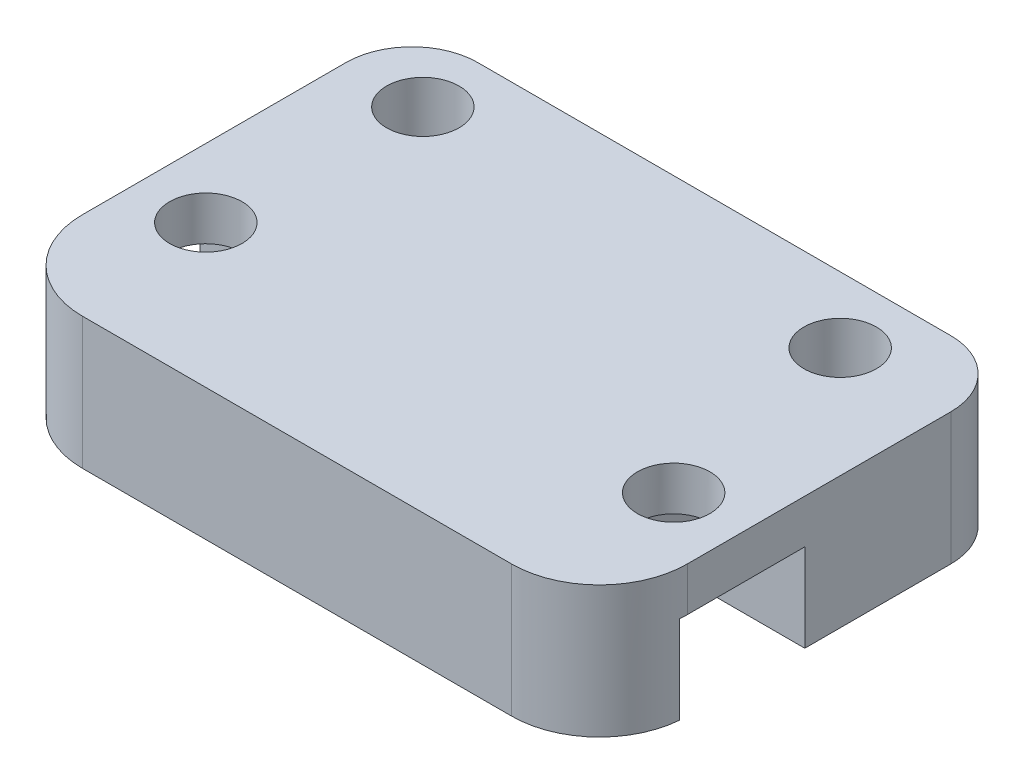
ISO-10303-21;
HEADER;
FILE_DESCRIPTION(('STEP AP214'),'2;1');
FILE_NAME('part.step','',(''),(''),'','','');
FILE_SCHEMA(('AUTOMOTIVE_DESIGN { 1 0 10303 214 1 1 1 1 }'));
ENDSEC;
DATA;
#1=APPLICATION_CONTEXT('core data for automotive mechanical design processes');
#2=APPLICATION_PROTOCOL_DEFINITION('international standard','automotive_design',2000,#1);
#3=PRODUCT_CONTEXT('',#1,'mechanical');
#4=PRODUCT('Part','Part','',(#3));
#5=PRODUCT_RELATED_PRODUCT_CATEGORY('part','',(#4));
#6=PRODUCT_DEFINITION_FORMATION('','',#4);
#7=PRODUCT_DEFINITION_CONTEXT('part definition',#1,'design');
#8=PRODUCT_DEFINITION('design','',#6,#7);
#9=PRODUCT_DEFINITION_SHAPE('','',#8);
#10=(LENGTH_UNIT() NAMED_UNIT(*) SI_UNIT(.MILLI.,.METRE.));
#11=(NAMED_UNIT(*) PLANE_ANGLE_UNIT() SI_UNIT($,.RADIAN.));
#12=(NAMED_UNIT(*) SI_UNIT($,.STERADIAN.) SOLID_ANGLE_UNIT());
#13=UNCERTAINTY_MEASURE_WITH_UNIT(LENGTH_MEASURE(1.E-05),#10,'distance_accuracy_value','');
#14=(GEOMETRIC_REPRESENTATION_CONTEXT(3) GLOBAL_UNCERTAINTY_ASSIGNED_CONTEXT((#13)) GLOBAL_UNIT_ASSIGNED_CONTEXT((#10,
#11,#12)) REPRESENTATION_CONTEXT('',''));
#15=CARTESIAN_POINT('',(0.,0.,0.));
#16=DIRECTION('',(0.,0.,1.));
#17=DIRECTION('',(1.,0.,0.));
#18=AXIS2_PLACEMENT_3D('',#15,#16,#17);
#19=CARTESIAN_POINT('',(10.65,-3.,6.5));
#20=DIRECTION('',(0.,1.,0.));
#21=DIRECTION('',(0.,0.,1.));
#22=AXIS2_PLACEMENT_3D('',#19,#20,#21);
#23=CYLINDRICAL_SURFACE('',#22,1.65);
#24=CARTESIAN_POINT('',(10.65,3.,6.5));
#25=DIRECTION('',(0.,1.,0.));
#26=DIRECTION('',(0.,0.,1.));
#27=AXIS2_PLACEMENT_3D('',#24,#25,#26);
#28=CIRCLE('',#27,1.65);
#29=CARTESIAN_POINT('',(10.65,3.,8.15));
#30=VERTEX_POINT('',#29);
#31=EDGE_CURVE('E256',#30,#30,#28,.T.);
#32=ORIENTED_EDGE('',*,*,#31,.T.);
#33=EDGE_LOOP('',(#32));
#34=FACE_BOUND('',#33,.T.);
#35=CARTESIAN_POINT('',(10.65,1.,6.5));
#36=DIRECTION('',(0.,-1.,0.));
#37=DIRECTION('',(0.,0.,-1.));
#38=AXIS2_PLACEMENT_3D('',#35,#36,#37);
#39=CIRCLE('',#38,1.65);
#40=CARTESIAN_POINT('',(10.65,1.,4.85));
#41=VERTEX_POINT('',#40);
#42=EDGE_CURVE('E235',#41,#41,#39,.F.);
#43=ORIENTED_EDGE('',*,*,#42,.F.);
#44=EDGE_LOOP('',(#43));
#45=FACE_BOUND('',#44,.T.);
#46=ADVANCED_FACE('F38',(#34,#45),#23,.F.);
#47=CARTESIAN_POINT('',(0.,-3.,13.));
#48=DIRECTION('',(0.,1.,0.));
#49=DIRECTION('',(0.,0.,1.));
#50=AXIS2_PLACEMENT_3D('',#47,#48,#49);
#51=PLANE('',#50);
#52=CARTESIAN_POINT('',(8.73,-3.,-3.00000000000006));
#53=DIRECTION('',(0.,1.,0.));
#54=DIRECTION('',(0.,0.,1.));
#55=AXIS2_PLACEMENT_3D('',#52,#53,#54);
#56=CIRCLE('',#55,1.65);
#57=CARTESIAN_POINT('',(8.73,-3.,-1.35000000000006));
#58=VERTEX_POINT('',#57);
#59=EDGE_CURVE('E247',#58,#58,#56,.T.);
#60=ORIENTED_EDGE('',*,*,#59,.T.);
#61=EDGE_LOOP('',(#60));
#62=FACE_BOUND('',#61,.T.);
#63=CARTESIAN_POINT('',(-10.27,-3.,-3.00000000000007));
#64=DIRECTION('',(0.,1.,0.));
#65=DIRECTION('',(0.,0.,1.));
#66=AXIS2_PLACEMENT_3D('',#63,#64,#65);
#67=CIRCLE('',#66,1.65);
#68=CARTESIAN_POINT('',(-10.27,-3.,-1.35000000000007));
#69=VERTEX_POINT('',#68);
#70=EDGE_CURVE('E242',#69,#69,#67,.T.);
#71=ORIENTED_EDGE('',*,*,#70,.T.);
#72=EDGE_LOOP('',(#71));
#73=FACE_BOUND('',#72,.T.);
#74=CARTESIAN_POINT('',(-9.77,-3.,9.));
#75=DIRECTION('',(0.,1.,0.));
#76=DIRECTION('',(0.,0.,1.));
#77=AXIS2_PLACEMENT_3D('',#74,#75,#76);
#78=CIRCLE('',#77,4.);
#79=CARTESIAN_POINT('',(-9.77,-3.,13.));
#80=VERTEX_POINT('',#79);
#81=CARTESIAN_POINT('',(-13.7546580781794,-3.,9.35));
#82=VERTEX_POINT('',#81);
#83=EDGE_CURVE('E290',#80,#82,#78,.F.);
#84=ORIENTED_EDGE('',*,*,#83,.T.);
#85=DIRECTION('',(-1.,0.,0.));
#86=VECTOR('',#85,1.);
#87=CARTESIAN_POINT('',(-12.2954482671904,-3.,9.35));
#88=LINE('',#87,#86);
#89=CARTESIAN_POINT('',(-9.00455173280957,-3.,9.35));
#90=VERTEX_POINT('',#89);
#91=EDGE_CURVE('E174',#90,#82,#88,.T.);
#92=ORIENTED_EDGE('',*,*,#91,.F.);
#93=DIRECTION('',(-0.5,0.,0.866025403784439));
#94=VECTOR('',#93,1.);
#95=CARTESIAN_POINT('',(-7.35910346561913,-3.,6.5));
#96=LINE('',#95,#94);
#97=CARTESIAN_POINT('',(-7.35910346561913,-3.,6.5));
#98=VERTEX_POINT('',#97);
#99=EDGE_CURVE('E197',#98,#90,#96,.T.);
#100=ORIENTED_EDGE('',*,*,#99,.F.);
#101=DIRECTION('',(0.5,0.,0.866025403784439));
#102=VECTOR('',#101,1.);
#103=CARTESIAN_POINT('',(-9.00455173280957,-3.,3.65));
#104=LINE('',#103,#102);
#105=CARTESIAN_POINT('',(-9.00455173280957,-3.,3.65));
#106=VERTEX_POINT('',#105);
#107=EDGE_CURVE('E194',#106,#98,#104,.T.);
#108=ORIENTED_EDGE('',*,*,#107,.F.);
#109=DIRECTION('',(1.,0.,0.));
#110=VECTOR('',#109,1.);
#111=CARTESIAN_POINT('',(-12.2954482671904,-3.,3.65));
#112=LINE('',#111,#110);
#113=CARTESIAN_POINT('',(-13.77,-3.,3.65));
#114=VERTEX_POINT('',#113);
#115=EDGE_CURVE('E180',#114,#106,#112,.T.);
#116=ORIENTED_EDGE('',*,*,#115,.F.);
#117=DIRECTION('',(0.,0.,-1.));
#118=VECTOR('',#117,1.);
#119=CARTESIAN_POINT('',(-13.77,-3.,13.));
#120=LINE('',#119,#118);
#121=CARTESIAN_POINT('',(-13.77,-3.,-2.99999999999999));
#122=VERTEX_POINT('',#121);
#123=EDGE_CURVE('E268',#114,#122,#120,.T.);
#124=ORIENTED_EDGE('',*,*,#123,.T.);
#125=CARTESIAN_POINT('',(-10.77,-3.,-3.));
#126=DIRECTION('',(0.,1.,0.));
#127=DIRECTION('',(0.,0.,1.));
#128=AXIS2_PLACEMENT_3D('',#125,#126,#127);
#129=CIRCLE('',#128,3.);
#130=CARTESIAN_POINT('',(-10.77,-3.,-6.));
#131=VERTEX_POINT('',#130);
#132=EDGE_CURVE('E303',#122,#131,#129,.F.);
#133=ORIENTED_EDGE('',*,*,#132,.T.);
#134=DIRECTION('',(-1.,0.,0.));
#135=VECTOR('',#134,1.);
#136=CARTESIAN_POINT('',(13.77,-3.,-6.));
#137=LINE('',#136,#135);
#138=CARTESIAN_POINT('',(10.77,-3.,-6.));
#139=VERTEX_POINT('',#138);
#140=EDGE_CURVE('E250',#139,#131,#137,.T.);
#141=ORIENTED_EDGE('',*,*,#140,.F.);
#142=CARTESIAN_POINT('',(10.77,-3.,-3.));
#143=DIRECTION('',(0.,1.,0.));
#144=DIRECTION('',(0.,0.,1.));
#145=AXIS2_PLACEMENT_3D('',#142,#143,#144);
#146=CIRCLE('',#145,3.);
#147=CARTESIAN_POINT('',(13.77,-3.,-2.99999999999999));
#148=VERTEX_POINT('',#147);
#149=EDGE_CURVE('E305',#139,#148,#146,.F.);
#150=ORIENTED_EDGE('',*,*,#149,.T.);
#151=DIRECTION('',(0.,0.,-1.));
#152=VECTOR('',#151,1.);
#153=CARTESIAN_POINT('',(13.77,-3.,13.));
#154=LINE('',#153,#152);
#155=CARTESIAN_POINT('',(13.77,-3.,3.65));
#156=VERTEX_POINT('',#155);
#157=EDGE_CURVE('E276',#156,#148,#154,.T.);
#158=ORIENTED_EDGE('',*,*,#157,.F.);
#159=DIRECTION('',(1.,0.,0.));
#160=VECTOR('',#159,1.);
#161=CARTESIAN_POINT('',(9.00455173280957,-3.,3.65));
#162=LINE('',#161,#160);
#163=CARTESIAN_POINT('',(9.00455173280957,-3.,3.65));
#164=VERTEX_POINT('',#163);
#165=EDGE_CURVE('E207',#164,#156,#162,.T.);
#166=ORIENTED_EDGE('',*,*,#165,.F.);
#167=DIRECTION('',(0.5,0.,-0.866025403784439));
#168=VECTOR('',#167,1.);
#169=CARTESIAN_POINT('',(7.35910346561913,-3.,6.5));
#170=LINE('',#169,#168);
#171=CARTESIAN_POINT('',(7.35910346561913,-3.,6.5));
#172=VERTEX_POINT('',#171);
#173=EDGE_CURVE('E221',#172,#164,#170,.T.);
#174=ORIENTED_EDGE('',*,*,#173,.F.);
#175=DIRECTION('',(-0.5,0.,-0.866025403784439));
#176=VECTOR('',#175,1.);
#177=CARTESIAN_POINT('',(9.00455173280957,-3.,9.35));
#178=LINE('',#177,#176);
#179=CARTESIAN_POINT('',(9.00455173280957,-3.,9.35));
#180=VERTEX_POINT('',#179);
#181=EDGE_CURVE('E218',#180,#172,#178,.T.);
#182=ORIENTED_EDGE('',*,*,#181,.F.);
#183=DIRECTION('',(-1.,0.,0.));
#184=VECTOR('',#183,1.);
#185=CARTESIAN_POINT('',(12.2954482671904,-3.,9.35));
#186=LINE('',#185,#184);
#187=CARTESIAN_POINT('',(13.7546580781794,-3.,9.35));
#188=VERTEX_POINT('',#187);
#189=EDGE_CURVE('E216',#188,#180,#186,.T.);
#190=ORIENTED_EDGE('',*,*,#189,.F.);
#191=CARTESIAN_POINT('',(9.77,-3.,9.));
#192=DIRECTION('',(0.,1.,0.));
#193=DIRECTION('',(0.,0.,1.));
#194=AXIS2_PLACEMENT_3D('',#191,#192,#193);
#195=CIRCLE('',#194,4.);
#196=CARTESIAN_POINT('',(9.77,-3.,13.));
#197=VERTEX_POINT('',#196);
#198=EDGE_CURVE('E293',#188,#197,#195,.F.);
#199=ORIENTED_EDGE('',*,*,#198,.T.);
#200=DIRECTION('',(1.,0.,0.));
#201=VECTOR('',#200,1.);
#202=CARTESIAN_POINT('',(0.,-3.,13.));
#203=LINE('',#202,#201);
#204=EDGE_CURVE('E260',#80,#197,#203,.T.);
#205=ORIENTED_EDGE('',*,*,#204,.F.);
#206=EDGE_LOOP('',(#84,#92,#100,#108,#116,#124,#133,#141,#150,#158,#166,#174,#182,#190,#199,#205));
#207=FACE_BOUND('',#206,.T.);
#208=ADVANCED_FACE('F327',(#62,#73,#207),#51,.F.);
#209=CARTESIAN_POINT('',(13.77,0.,13.));
#210=DIRECTION('',(-1.,0.,0.));
#211=DIRECTION('',(0.,0.,1.));
#212=AXIS2_PLACEMENT_3D('',#209,#210,#211);
#213=PLANE('',#212);
#214=DIRECTION('',(0.,0.,1.));
#215=VECTOR('',#214,1.);
#216=CARTESIAN_POINT('',(13.77,1.,13.));
#217=LINE('',#216,#215);
#218=CARTESIAN_POINT('',(13.77,1.,3.65));
#219=VERTEX_POINT('',#218);
#220=CARTESIAN_POINT('',(13.77,1.,9.));
#221=VERTEX_POINT('',#220);
#222=EDGE_CURVE('E53',#219,#221,#217,.T.);
#223=ORIENTED_EDGE('',*,*,#222,.F.);
#224=DIRECTION('',(0.,-1.,0.));
#225=VECTOR('',#224,1.);
#226=CARTESIAN_POINT('',(13.77,0.,3.65));
#227=LINE('',#226,#225);
#228=EDGE_CURVE('E11',#219,#156,#227,.T.);
#229=ORIENTED_EDGE('',*,*,#228,.T.);
#230=ORIENTED_EDGE('',*,*,#157,.T.);
#231=DIRECTION('',(0.,-1.,0.));
#232=VECTOR('',#231,1.);
#233=CARTESIAN_POINT('',(13.77,3.,-3.));
#234=LINE('',#233,#232);
#235=CARTESIAN_POINT('',(13.77,3.,-2.99999999999999));
#236=VERTEX_POINT('',#235);
#237=EDGE_CURVE('E308',#148,#236,#234,.F.);
#238=ORIENTED_EDGE('',*,*,#237,.T.);
#239=DIRECTION('',(0.,0.,-1.));
#240=VECTOR('',#239,1.);
#241=CARTESIAN_POINT('',(13.77,3.,13.));
#242=LINE('',#241,#240);
#243=CARTESIAN_POINT('',(13.77,3.,9.));
#244=VERTEX_POINT('',#243);
#245=EDGE_CURVE('E273',#244,#236,#242,.T.);
#246=ORIENTED_EDGE('',*,*,#245,.F.);
#247=DIRECTION('',(0.,1.,0.));
#248=VECTOR('',#247,1.);
#249=CARTESIAN_POINT('',(13.77,-3.,9.));
#250=LINE('',#249,#248);
#251=EDGE_CURVE('E287',#244,#221,#250,.F.);
#252=ORIENTED_EDGE('',*,*,#251,.T.);
#253=EDGE_LOOP('',(#223,#229,#230,#238,#246,#252));
#254=FACE_BOUND('',#253,.T.);
#255=ADVANCED_FACE('F348',(#254),#213,.F.);
#256=CARTESIAN_POINT('',(0.,3.,13.));
#257=DIRECTION('',(0.,1.,0.));
#258=DIRECTION('',(0.,0.,1.));
#259=AXIS2_PLACEMENT_3D('',#256,#257,#258);
#260=PLANE('',#259);
#261=CARTESIAN_POINT('',(8.73,3.,-3.00000000000006));
#262=DIRECTION('',(0.,-1.,0.));
#263=DIRECTION('',(0.,0.,-1.));
#264=AXIS2_PLACEMENT_3D('',#261,#262,#263);
#265=CIRCLE('',#264,1.65);
#266=CARTESIAN_POINT('',(8.73,3.,-4.65000000000006));
#267=VERTEX_POINT('',#266);
#268=EDGE_CURVE('E239',#267,#267,#265,.T.);
#269=ORIENTED_EDGE('',*,*,#268,.T.);
#270=EDGE_LOOP('',(#269));
#271=FACE_BOUND('',#270,.T.);
#272=CARTESIAN_POINT('',(-10.27,3.,-3.00000000000007));
#273=DIRECTION('',(0.,-1.,0.));
#274=DIRECTION('',(0.,0.,-1.));
#275=AXIS2_PLACEMENT_3D('',#272,#273,#274);
#276=CIRCLE('',#275,1.65);
#277=CARTESIAN_POINT('',(-10.27,3.,-4.65000000000007));
#278=VERTEX_POINT('',#277);
#279=EDGE_CURVE('E238',#278,#278,#276,.T.);
#280=ORIENTED_EDGE('',*,*,#279,.T.);
#281=EDGE_LOOP('',(#280));
#282=FACE_BOUND('',#281,.T.);
#283=CARTESIAN_POINT('',(-10.65,3.,6.5));
#284=DIRECTION('',(0.,1.,0.));
#285=DIRECTION('',(0.,0.,1.));
#286=AXIS2_PLACEMENT_3D('',#283,#284,#285);
#287=CIRCLE('',#286,1.65);
#288=CARTESIAN_POINT('',(-10.65,3.,8.15));
#289=VERTEX_POINT('',#288);
#290=EDGE_CURVE('E257',#289,#289,#287,.T.);
#291=ORIENTED_EDGE('',*,*,#290,.F.);
#292=EDGE_LOOP('',(#291));
#293=FACE_BOUND('',#292,.T.);
#294=ORIENTED_EDGE('',*,*,#31,.F.);
#295=EDGE_LOOP('',(#294));
#296=FACE_BOUND('',#295,.T.);
#297=ORIENTED_EDGE('',*,*,#245,.T.);
#298=CARTESIAN_POINT('',(10.77,3.,-3.));
#299=DIRECTION('',(0.,1.,0.));
#300=DIRECTION('',(0.,0.,1.));
#301=AXIS2_PLACEMENT_3D('',#298,#299,#300);
#302=CIRCLE('',#301,3.);
#303=CARTESIAN_POINT('',(10.77,3.,-6.));
#304=VERTEX_POINT('',#303);
#305=EDGE_CURVE('E312',#236,#304,#302,.T.);
#306=ORIENTED_EDGE('',*,*,#305,.T.);
#307=DIRECTION('',(1.,0.,0.));
#308=VECTOR('',#307,1.);
#309=CARTESIAN_POINT('',(-13.77,3.,-6.));
#310=LINE('',#309,#308);
#311=CARTESIAN_POINT('',(-10.77,3.,-6.));
#312=VERTEX_POINT('',#311);
#313=EDGE_CURVE('E253',#312,#304,#310,.T.);
#314=ORIENTED_EDGE('',*,*,#313,.F.);
#315=CARTESIAN_POINT('',(-10.77,3.,-3.));
#316=DIRECTION('',(0.,1.,0.));
#317=DIRECTION('',(0.,0.,1.));
#318=AXIS2_PLACEMENT_3D('',#315,#316,#317);
#319=CIRCLE('',#318,3.);
#320=CARTESIAN_POINT('',(-13.77,3.,-2.99999999999999));
#321=VERTEX_POINT('',#320);
#322=EDGE_CURVE('E310',#312,#321,#319,.T.);
#323=ORIENTED_EDGE('',*,*,#322,.T.);
#324=DIRECTION('',(0.,0.,-1.));
#325=VECTOR('',#324,1.);
#326=CARTESIAN_POINT('',(-13.77,3.,13.));
#327=LINE('',#326,#325);
#328=CARTESIAN_POINT('',(-13.77,3.,9.));
#329=VERTEX_POINT('',#328);
#330=EDGE_CURVE('E270',#329,#321,#327,.T.);
#331=ORIENTED_EDGE('',*,*,#330,.F.);
#332=CARTESIAN_POINT('',(-9.77,3.,9.));
#333=DIRECTION('',(0.,1.,0.));
#334=DIRECTION('',(0.,0.,1.));
#335=AXIS2_PLACEMENT_3D('',#332,#333,#334);
#336=CIRCLE('',#335,4.);
#337=CARTESIAN_POINT('',(-9.77,3.,13.));
#338=VERTEX_POINT('',#337);
#339=EDGE_CURVE('E283',#329,#338,#336,.T.);
#340=ORIENTED_EDGE('',*,*,#339,.T.);
#341=DIRECTION('',(1.,0.,0.));
#342=VECTOR('',#341,1.);
#343=CARTESIAN_POINT('',(0.,3.,13.));
#344=LINE('',#343,#342);
#345=CARTESIAN_POINT('',(9.77,3.,13.));
#346=VERTEX_POINT('',#345);
#347=EDGE_CURVE('E265',#338,#346,#344,.T.);
#348=ORIENTED_EDGE('',*,*,#347,.T.);
#349=CARTESIAN_POINT('',(9.77,3.,9.));
#350=DIRECTION('',(0.,1.,0.));
#351=DIRECTION('',(0.,0.,1.));
#352=AXIS2_PLACEMENT_3D('',#349,#350,#351);
#353=CIRCLE('',#352,4.);
#354=EDGE_CURVE('E285',#346,#244,#353,.T.);
#355=ORIENTED_EDGE('',*,*,#354,.T.);
#356=EDGE_LOOP('',(#297,#306,#314,#323,#331,#340,#348,#355));
#357=FACE_BOUND('',#356,.T.);
#358=ADVANCED_FACE('F415',(#271,#282,#293,#296,#357),#260,.T.);
#359=CARTESIAN_POINT('',(-13.77,0.,13.));
#360=DIRECTION('',(-1.,0.,0.));
#361=DIRECTION('',(0.,0.,1.));
#362=AXIS2_PLACEMENT_3D('',#359,#360,#361);
#363=PLANE('',#362);
#364=DIRECTION('',(0.,-1.,0.));
#365=VECTOR('',#364,1.);
#366=CARTESIAN_POINT('',(-13.77,0.,3.65));
#367=LINE('',#366,#365);
#368=CARTESIAN_POINT('',(-13.77,1.,3.65));
#369=VERTEX_POINT('',#368);
#370=EDGE_CURVE('E46',#369,#114,#367,.T.);
#371=ORIENTED_EDGE('',*,*,#370,.F.);
#372=DIRECTION('',(0.,0.,-1.));
#373=VECTOR('',#372,1.);
#374=CARTESIAN_POINT('',(-13.77,1.,13.));
#375=LINE('',#374,#373);
#376=CARTESIAN_POINT('',(-13.77,1.,9.));
#377=VERTEX_POINT('',#376);
#378=EDGE_CURVE('E171',#377,#369,#375,.T.);
#379=ORIENTED_EDGE('',*,*,#378,.F.);
#380=DIRECTION('',(0.,1.,0.));
#381=VECTOR('',#380,1.);
#382=CARTESIAN_POINT('',(-13.77,0.,9.));
#383=LINE('',#382,#381);
#384=EDGE_CURVE('E295',#377,#329,#383,.T.);
#385=ORIENTED_EDGE('',*,*,#384,.T.);
#386=ORIENTED_EDGE('',*,*,#330,.T.);
#387=DIRECTION('',(0.,1.,0.));
#388=VECTOR('',#387,1.);
#389=CARTESIAN_POINT('',(-13.77,0.,-3.));
#390=LINE('',#389,#388);
#391=EDGE_CURVE('E314',#321,#122,#390,.F.);
#392=ORIENTED_EDGE('',*,*,#391,.T.);
#393=ORIENTED_EDGE('',*,*,#123,.F.);
#394=EDGE_LOOP('',(#371,#379,#385,#386,#392,#393));
#395=FACE_BOUND('',#394,.T.);
#396=ADVANCED_FACE('F329',(#395),#363,.T.);
#397=CARTESIAN_POINT('',(0.,0.,13.));
#398=DIRECTION('',(0.,0.,1.));
#399=DIRECTION('',(1.,0.,0.));
#400=AXIS2_PLACEMENT_3D('',#397,#398,#399);
#401=PLANE('',#400);
#402=ORIENTED_EDGE('',*,*,#204,.T.);
#403=DIRECTION('',(0.,1.,0.));
#404=VECTOR('',#403,1.);
#405=CARTESIAN_POINT('',(9.77,3.,13.));
#406=LINE('',#405,#404);
#407=EDGE_CURVE('E280',#197,#346,#406,.T.);
#408=ORIENTED_EDGE('',*,*,#407,.T.);
#409=ORIENTED_EDGE('',*,*,#347,.F.);
#410=DIRECTION('',(0.,1.,0.));
#411=VECTOR('',#410,1.);
#412=CARTESIAN_POINT('',(-9.77,0.,13.));
#413=LINE('',#412,#411);
#414=EDGE_CURVE('E278',#338,#80,#413,.F.);
#415=ORIENTED_EDGE('',*,*,#414,.T.);
#416=EDGE_LOOP('',(#402,#408,#409,#415));
#417=FACE_BOUND('',#416,.T.);
#418=ADVANCED_FACE('F376',(#417),#401,.T.);
#419=CARTESIAN_POINT('',(-10.65,-3.,6.5));
#420=DIRECTION('',(0.,1.,0.));
#421=DIRECTION('',(0.,0.,1.));
#422=AXIS2_PLACEMENT_3D('',#419,#420,#421);
#423=CYLINDRICAL_SURFACE('',#422,1.65);
#424=CARTESIAN_POINT('',(-10.65,1.,6.5));
#425=DIRECTION('',(0.,1.,0.));
#426=DIRECTION('',(0.,0.,1.));
#427=AXIS2_PLACEMENT_3D('',#424,#425,#426);
#428=CIRCLE('',#427,1.65);
#429=CARTESIAN_POINT('',(-10.65,1.,8.15));
#430=VERTEX_POINT('',#429);
#431=EDGE_CURVE('E231',#430,#430,#428,.F.);
#432=ORIENTED_EDGE('',*,*,#431,.T.);
#433=EDGE_LOOP('',(#432));
#434=FACE_BOUND('',#433,.T.);
#435=ORIENTED_EDGE('',*,*,#290,.T.);
#436=EDGE_LOOP('',(#435));
#437=FACE_BOUND('',#436,.T.);
#438=ADVANCED_FACE('F409',(#434,#437),#423,.F.);
#439=CARTESIAN_POINT('',(0.,0.,-6.));
#440=DIRECTION('',(0.,0.,-1.));
#441=DIRECTION('',(-1.,0.,0.));
#442=AXIS2_PLACEMENT_3D('',#439,#440,#441);
#443=PLANE('',#442);
#444=ORIENTED_EDGE('',*,*,#313,.T.);
#445=DIRECTION('',(0.,-1.,0.));
#446=VECTOR('',#445,1.);
#447=CARTESIAN_POINT('',(10.77,-3.,-6.));
#448=LINE('',#447,#446);
#449=EDGE_CURVE('E300',#304,#139,#448,.T.);
#450=ORIENTED_EDGE('',*,*,#449,.T.);
#451=ORIENTED_EDGE('',*,*,#140,.T.);
#452=DIRECTION('',(0.,1.,0.));
#453=VECTOR('',#452,1.);
#454=CARTESIAN_POINT('',(-10.77,0.,-6.));
#455=LINE('',#454,#453);
#456=EDGE_CURVE('E297',#131,#312,#455,.T.);
#457=ORIENTED_EDGE('',*,*,#456,.T.);
#458=EDGE_LOOP('',(#444,#450,#451,#457));
#459=FACE_BOUND('',#458,.T.);
#460=ADVANCED_FACE('F337',(#459),#443,.T.);
#461=CARTESIAN_POINT('',(9.77,0.,9.));
#462=DIRECTION('',(0.,-1.,0.));
#463=DIRECTION('',(0.,0.,-1.));
#464=AXIS2_PLACEMENT_3D('',#461,#462,#463);
#465=CYLINDRICAL_SURFACE('',#464,4.);
#466=DIRECTION('',(0.,-1.,0.));
#467=VECTOR('',#466,1.);
#468=CARTESIAN_POINT('',(13.7546580781794,0.,9.35));
#469=LINE('',#468,#467);
#470=CARTESIAN_POINT('',(13.7546580781794,1.,9.35));
#471=VERTEX_POINT('',#470);
#472=EDGE_CURVE('E323',#471,#188,#469,.T.);
#473=ORIENTED_EDGE('',*,*,#472,.F.);
#474=CARTESIAN_POINT('',(9.77,1.,9.));
#475=DIRECTION('',(0.,-1.,0.));
#476=DIRECTION('',(0.,0.,-1.));
#477=AXIS2_PLACEMENT_3D('',#474,#475,#476);
#478=CIRCLE('',#477,4.);
#479=EDGE_CURVE('E321',#471,#221,#478,.F.);
#480=ORIENTED_EDGE('',*,*,#479,.T.);
#481=ORIENTED_EDGE('',*,*,#251,.F.);
#482=ORIENTED_EDGE('',*,*,#354,.F.);
#483=ORIENTED_EDGE('',*,*,#407,.F.);
#484=ORIENTED_EDGE('',*,*,#198,.F.);
#485=EDGE_LOOP('',(#473,#480,#481,#482,#483,#484));
#486=FACE_BOUND('',#485,.T.);
#487=ADVANCED_FACE('F370',(#486),#465,.T.);
#488=CARTESIAN_POINT('',(-9.77,0.,9.));
#489=DIRECTION('',(0.,1.,0.));
#490=DIRECTION('',(0.,0.,1.));
#491=AXIS2_PLACEMENT_3D('',#488,#489,#490);
#492=CYLINDRICAL_SURFACE('',#491,4.);
#493=DIRECTION('',(0.,1.,0.));
#494=VECTOR('',#493,1.);
#495=CARTESIAN_POINT('',(-13.7546580781794,0.,9.35));
#496=LINE('',#495,#494);
#497=CARTESIAN_POINT('',(-13.7546580781794,1.,9.35));
#498=VERTEX_POINT('',#497);
#499=EDGE_CURVE('E319',#82,#498,#496,.T.);
#500=ORIENTED_EDGE('',*,*,#499,.F.);
#501=ORIENTED_EDGE('',*,*,#83,.F.);
#502=ORIENTED_EDGE('',*,*,#414,.F.);
#503=ORIENTED_EDGE('',*,*,#339,.F.);
#504=ORIENTED_EDGE('',*,*,#384,.F.);
#505=CARTESIAN_POINT('',(-9.77,1.,9.));
#506=DIRECTION('',(0.,1.,0.));
#507=DIRECTION('',(0.,0.,1.));
#508=AXIS2_PLACEMENT_3D('',#505,#506,#507);
#509=CIRCLE('',#508,4.);
#510=EDGE_CURVE('E317',#498,#377,#509,.F.);
#511=ORIENTED_EDGE('',*,*,#510,.F.);
#512=EDGE_LOOP('',(#500,#501,#502,#503,#504,#511));
#513=FACE_BOUND('',#512,.T.);
#514=ADVANCED_FACE('F382',(#513),#492,.T.);
#515=CARTESIAN_POINT('',(10.77,0.,-3.));
#516=DIRECTION('',(0.,1.,0.));
#517=DIRECTION('',(0.,0.,1.));
#518=AXIS2_PLACEMENT_3D('',#515,#516,#517);
#519=CYLINDRICAL_SURFACE('',#518,3.);
#520=ORIENTED_EDGE('',*,*,#305,.F.);
#521=ORIENTED_EDGE('',*,*,#237,.F.);
#522=ORIENTED_EDGE('',*,*,#149,.F.);
#523=ORIENTED_EDGE('',*,*,#449,.F.);
#524=EDGE_LOOP('',(#520,#521,#522,#523));
#525=FACE_BOUND('',#524,.T.);
#526=ADVANCED_FACE('F342',(#525),#519,.T.);
#527=CARTESIAN_POINT('',(-10.77,0.,-3.));
#528=DIRECTION('',(0.,1.,0.));
#529=DIRECTION('',(0.,0.,1.));
#530=AXIS2_PLACEMENT_3D('',#527,#528,#529);
#531=CYLINDRICAL_SURFACE('',#530,3.);
#532=ORIENTED_EDGE('',*,*,#132,.F.);
#533=ORIENTED_EDGE('',*,*,#391,.F.);
#534=ORIENTED_EDGE('',*,*,#322,.F.);
#535=ORIENTED_EDGE('',*,*,#456,.F.);
#536=EDGE_LOOP('',(#532,#533,#534,#535));
#537=FACE_BOUND('',#536,.T.);
#538=ADVANCED_FACE('F40',(#537),#531,.T.);
#539=CARTESIAN_POINT('',(-10.27,3.,-3.00000000000007));
#540=DIRECTION('',(0.,-1.,0.));
#541=DIRECTION('',(0.,0.,-1.));
#542=AXIS2_PLACEMENT_3D('',#539,#540,#541);
#543=CYLINDRICAL_SURFACE('',#542,1.65);
#544=ORIENTED_EDGE('',*,*,#279,.F.);
#545=EDGE_LOOP('',(#544));
#546=FACE_BOUND('',#545,.T.);
#547=ORIENTED_EDGE('',*,*,#70,.F.);
#548=EDGE_LOOP('',(#547));
#549=FACE_BOUND('',#548,.T.);
#550=ADVANCED_FACE('F428',(#546,#549),#543,.F.);
#551=CARTESIAN_POINT('',(8.73,3.,-3.00000000000006));
#552=DIRECTION('',(0.,-1.,0.));
#553=DIRECTION('',(0.,0.,-1.));
#554=AXIS2_PLACEMENT_3D('',#551,#552,#553);
#555=CYLINDRICAL_SURFACE('',#554,1.65);
#556=ORIENTED_EDGE('',*,*,#268,.F.);
#557=EDGE_LOOP('',(#556));
#558=FACE_BOUND('',#557,.T.);
#559=ORIENTED_EDGE('',*,*,#59,.F.);
#560=EDGE_LOOP('',(#559));
#561=FACE_BOUND('',#560,.T.);
#562=ADVANCED_FACE('F432',(#558,#561),#555,.F.);
#563=CARTESIAN_POINT('',(0.,1.,0.));
#564=DIRECTION('',(0.,1.,0.));
#565=DIRECTION('',(0.,0.,1.));
#566=AXIS2_PLACEMENT_3D('',#563,#564,#565);
#567=PLANE('',#566);
#568=ORIENTED_EDGE('',*,*,#378,.T.);
#569=DIRECTION('',(1.,0.,0.));
#570=VECTOR('',#569,1.);
#571=CARTESIAN_POINT('',(-15.2954482671904,1.,3.65));
#572=LINE('',#571,#570);
#573=CARTESIAN_POINT('',(-9.00455173280957,1.,3.65));
#574=VERTEX_POINT('',#573);
#575=EDGE_CURVE('E164',#369,#574,#572,.T.);
#576=ORIENTED_EDGE('',*,*,#575,.T.);
#577=DIRECTION('',(0.5,0.,0.866025403784439));
#578=VECTOR('',#577,1.);
#579=CARTESIAN_POINT('',(-9.00455173280957,1.,3.65));
#580=LINE('',#579,#578);
#581=CARTESIAN_POINT('',(-7.35910346561913,1.,6.5));
#582=VERTEX_POINT('',#581);
#583=EDGE_CURVE('E169',#574,#582,#580,.T.);
#584=ORIENTED_EDGE('',*,*,#583,.T.);
#585=DIRECTION('',(-0.5,0.,0.866025403784439));
#586=VECTOR('',#585,1.);
#587=CARTESIAN_POINT('',(-7.35910346561913,1.,6.5));
#588=LINE('',#587,#586);
#589=CARTESIAN_POINT('',(-9.00455173280957,1.,9.35));
#590=VERTEX_POINT('',#589);
#591=EDGE_CURVE('E188',#582,#590,#588,.T.);
#592=ORIENTED_EDGE('',*,*,#591,.T.);
#593=DIRECTION('',(-1.,0.,0.));
#594=VECTOR('',#593,1.);
#595=CARTESIAN_POINT('',(-9.00455173280957,1.,9.35));
#596=LINE('',#595,#594);
#597=EDGE_CURVE('E61',#590,#498,#596,.T.);
#598=ORIENTED_EDGE('',*,*,#597,.T.);
#599=ORIENTED_EDGE('',*,*,#510,.T.);
#600=EDGE_LOOP('',(#568,#576,#584,#592,#598,#599));
#601=FACE_BOUND('',#600,.T.);
#602=ORIENTED_EDGE('',*,*,#431,.F.);
#603=EDGE_LOOP('',(#602));
#604=FACE_BOUND('',#603,.T.);
#605=ADVANCED_FACE('F166',(#601,#604),#567,.F.);
#606=CARTESIAN_POINT('',(-12.2954482671904,1.,9.35));
#607=DIRECTION('',(0.,0.,1.));
#608=DIRECTION('',(1.,0.,0.));
#609=AXIS2_PLACEMENT_3D('',#606,#607,#608);
#610=PLANE('',#609);
#611=ORIENTED_EDGE('',*,*,#499,.T.);
#612=ORIENTED_EDGE('',*,*,#597,.F.);
#613=DIRECTION('',(0.,-1.,0.));
#614=VECTOR('',#613,1.);
#615=CARTESIAN_POINT('',(-9.00455173280957,1.,9.35));
#616=LINE('',#615,#614);
#617=EDGE_CURVE('E201',#590,#90,#616,.T.);
#618=ORIENTED_EDGE('',*,*,#617,.T.);
#619=ORIENTED_EDGE('',*,*,#91,.T.);
#620=EDGE_LOOP('',(#611,#612,#618,#619));
#621=FACE_BOUND('',#620,.T.);
#622=ADVANCED_FACE('F387',(#621),#610,.F.);
#623=CARTESIAN_POINT('',(-7.35910346561913,1.,6.5));
#624=DIRECTION('',(0.866025403784439,0.,0.5));
#625=DIRECTION('',(0.5,0.,-0.866025403784439));
#626=AXIS2_PLACEMENT_3D('',#623,#624,#625);
#627=PLANE('',#626);
#628=ORIENTED_EDGE('',*,*,#99,.T.);
#629=ORIENTED_EDGE('',*,*,#617,.F.);
#630=ORIENTED_EDGE('',*,*,#591,.F.);
#631=DIRECTION('',(0.,-1.,0.));
#632=VECTOR('',#631,1.);
#633=CARTESIAN_POINT('',(-7.35910346561913,1.,6.5));
#634=LINE('',#633,#632);
#635=EDGE_CURVE('E184',#582,#98,#634,.T.);
#636=ORIENTED_EDGE('',*,*,#635,.T.);
#637=EDGE_LOOP('',(#628,#629,#630,#636));
#638=FACE_BOUND('',#637,.T.);
#639=ADVANCED_FACE('F389',(#638),#627,.F.);
#640=CARTESIAN_POINT('',(-9.00455173280957,1.,3.65));
#641=DIRECTION('',(0.866025403784439,0.,-0.5));
#642=DIRECTION('',(-0.5,0.,-0.866025403784439));
#643=AXIS2_PLACEMENT_3D('',#640,#641,#642);
#644=PLANE('',#643);
#645=ORIENTED_EDGE('',*,*,#107,.T.);
#646=ORIENTED_EDGE('',*,*,#635,.F.);
#647=ORIENTED_EDGE('',*,*,#583,.F.);
#648=DIRECTION('',(0.,-1.,0.));
#649=VECTOR('',#648,1.);
#650=CARTESIAN_POINT('',(-9.00455173280957,1.,3.65));
#651=LINE('',#650,#649);
#652=EDGE_CURVE('E177',#574,#106,#651,.T.);
#653=ORIENTED_EDGE('',*,*,#652,.T.);
#654=EDGE_LOOP('',(#645,#646,#647,#653));
#655=FACE_BOUND('',#654,.T.);
#656=ADVANCED_FACE('F186',(#655),#644,.F.);
#657=CARTESIAN_POINT('',(-12.2954482671904,1.,3.65));
#658=DIRECTION('',(0.,0.,-1.));
#659=DIRECTION('',(-1.,0.,0.));
#660=AXIS2_PLACEMENT_3D('',#657,#658,#659);
#661=PLANE('',#660);
#662=ORIENTED_EDGE('',*,*,#370,.T.);
#663=ORIENTED_EDGE('',*,*,#115,.T.);
#664=ORIENTED_EDGE('',*,*,#652,.F.);
#665=ORIENTED_EDGE('',*,*,#575,.F.);
#666=EDGE_LOOP('',(#662,#663,#664,#665));
#667=FACE_BOUND('',#666,.T.);
#668=ADVANCED_FACE('F178',(#667),#661,.F.);
#669=CARTESIAN_POINT('',(9.00455173280957,1.,3.65));
#670=DIRECTION('',(0.,0.,-1.));
#671=DIRECTION('',(-1.,0.,0.));
#672=AXIS2_PLACEMENT_3D('',#669,#670,#671);
#673=PLANE('',#672);
#674=DIRECTION('',(1.,0.,0.));
#675=VECTOR('',#674,1.);
#676=CARTESIAN_POINT('',(15.2954482671904,1.,3.65));
#677=LINE('',#676,#675);
#678=CARTESIAN_POINT('',(9.00455173280957,1.,3.65));
#679=VERTEX_POINT('',#678);
#680=EDGE_CURVE('E204',#679,#219,#677,.T.);
#681=ORIENTED_EDGE('',*,*,#680,.F.);
#682=DIRECTION('',(0.,-1.,0.));
#683=VECTOR('',#682,1.);
#684=CARTESIAN_POINT('',(9.00455173280957,1.,3.65));
#685=LINE('',#684,#683);
#686=EDGE_CURVE('E195',#679,#164,#685,.T.);
#687=ORIENTED_EDGE('',*,*,#686,.T.);
#688=ORIENTED_EDGE('',*,*,#165,.T.);
#689=ORIENTED_EDGE('',*,*,#228,.F.);
#690=EDGE_LOOP('',(#681,#687,#688,#689));
#691=FACE_BOUND('',#690,.T.);
#692=ADVANCED_FACE('F351',(#691),#673,.F.);
#693=CARTESIAN_POINT('',(0.,1.,0.));
#694=DIRECTION('',(0.,-1.,0.));
#695=DIRECTION('',(0.,0.,-1.));
#696=AXIS2_PLACEMENT_3D('',#693,#694,#695);
#697=PLANE('',#696);
#698=ORIENTED_EDGE('',*,*,#222,.T.);
#699=ORIENTED_EDGE('',*,*,#479,.F.);
#700=DIRECTION('',(-1.,0.,0.));
#701=VECTOR('',#700,1.);
#702=CARTESIAN_POINT('',(12.2954482671904,1.,9.35));
#703=LINE('',#702,#701);
#704=CARTESIAN_POINT('',(9.00455173280957,1.,9.35));
#705=VERTEX_POINT('',#704);
#706=EDGE_CURVE('E206',#471,#705,#703,.T.);
#707=ORIENTED_EDGE('',*,*,#706,.T.);
#708=DIRECTION('',(-0.5,0.,-0.866025403784439));
#709=VECTOR('',#708,1.);
#710=CARTESIAN_POINT('',(9.00455173280957,1.,9.35));
#711=LINE('',#710,#709);
#712=CARTESIAN_POINT('',(7.35910346561913,1.,6.5));
#713=VERTEX_POINT('',#712);
#714=EDGE_CURVE('E209',#705,#713,#711,.T.);
#715=ORIENTED_EDGE('',*,*,#714,.T.);
#716=DIRECTION('',(0.5,0.,-0.866025403784439));
#717=VECTOR('',#716,1.);
#718=CARTESIAN_POINT('',(7.35910346561913,1.,6.5));
#719=LINE('',#718,#717);
#720=EDGE_CURVE('E212',#713,#679,#719,.T.);
#721=ORIENTED_EDGE('',*,*,#720,.T.);
#722=ORIENTED_EDGE('',*,*,#680,.T.);
#723=EDGE_LOOP('',(#698,#699,#707,#715,#721,#722));
#724=FACE_BOUND('',#723,.T.);
#725=ORIENTED_EDGE('',*,*,#42,.T.);
#726=EDGE_LOOP('',(#725));
#727=FACE_BOUND('',#726,.T.);
#728=ADVANCED_FACE('F353',(#724,#727),#697,.T.);
#729=CARTESIAN_POINT('',(7.35910346561913,1.,6.5));
#730=DIRECTION('',(-0.866025403784439,0.,-0.5));
#731=DIRECTION('',(-0.5,0.,0.866025403784439));
#732=AXIS2_PLACEMENT_3D('',#729,#730,#731);
#733=PLANE('',#732);
#734=ORIENTED_EDGE('',*,*,#173,.T.);
#735=ORIENTED_EDGE('',*,*,#686,.F.);
#736=ORIENTED_EDGE('',*,*,#720,.F.);
#737=DIRECTION('',(0.,-1.,0.));
#738=VECTOR('',#737,1.);
#739=CARTESIAN_POINT('',(7.35910346561913,1.,6.5));
#740=LINE('',#739,#738);
#741=EDGE_CURVE('E226',#713,#172,#740,.T.);
#742=ORIENTED_EDGE('',*,*,#741,.T.);
#743=EDGE_LOOP('',(#734,#735,#736,#742));
#744=FACE_BOUND('',#743,.T.);
#745=ADVANCED_FACE('F358',(#744),#733,.F.);
#746=CARTESIAN_POINT('',(9.00455173280957,1.,9.35));
#747=DIRECTION('',(-0.866025403784439,0.,0.5));
#748=DIRECTION('',(0.5,0.,0.866025403784439));
#749=AXIS2_PLACEMENT_3D('',#746,#747,#748);
#750=PLANE('',#749);
#751=ORIENTED_EDGE('',*,*,#181,.T.);
#752=ORIENTED_EDGE('',*,*,#741,.F.);
#753=ORIENTED_EDGE('',*,*,#714,.F.);
#754=DIRECTION('',(0.,-1.,0.));
#755=VECTOR('',#754,1.);
#756=CARTESIAN_POINT('',(9.00455173280957,1.,9.35));
#757=LINE('',#756,#755);
#758=EDGE_CURVE('E215',#705,#180,#757,.T.);
#759=ORIENTED_EDGE('',*,*,#758,.T.);
#760=EDGE_LOOP('',(#751,#752,#753,#759));
#761=FACE_BOUND('',#760,.T.);
#762=ADVANCED_FACE('F363',(#761),#750,.F.);
#763=CARTESIAN_POINT('',(12.2954482671904,1.,9.35));
#764=DIRECTION('',(0.,0.,1.));
#765=DIRECTION('',(1.,0.,0.));
#766=AXIS2_PLACEMENT_3D('',#763,#764,#765);
#767=PLANE('',#766);
#768=ORIENTED_EDGE('',*,*,#472,.T.);
#769=ORIENTED_EDGE('',*,*,#189,.T.);
#770=ORIENTED_EDGE('',*,*,#758,.F.);
#771=ORIENTED_EDGE('',*,*,#706,.F.);
#772=EDGE_LOOP('',(#768,#769,#770,#771));
#773=FACE_BOUND('',#772,.T.);
#774=ADVANCED_FACE('F367',(#773),#767,.F.);
#775=CLOSED_SHELL('',(#46,#208,#255,#358,#396,#418,#438,#460,#487,#514,#526,#538,#550,#562,#605,
#622,#639,#656,#668,#692,#728,#745,#762,#774));
#776=MANIFOLD_SOLID_BREP('B2',#775);
#777=ADVANCED_BREP_SHAPE_REPRESENTATION('',(#18,#776),#14);
#778=SHAPE_DEFINITION_REPRESENTATION(#9,#777);
ENDSEC;
END-ISO-10303-21;
